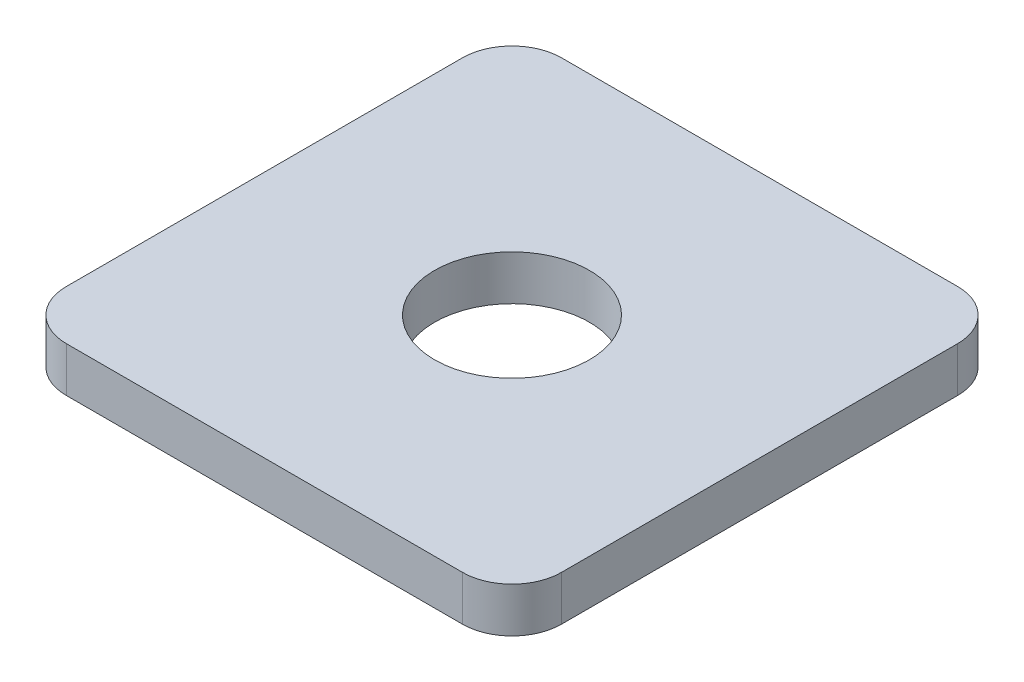
ISO-10303-21;
HEADER;
FILE_DESCRIPTION(('STEP AP214'),'2;1');
FILE_NAME('part.step','',(''),(''),'','','');
FILE_SCHEMA(('AUTOMOTIVE_DESIGN { 1 0 10303 214 1 1 1 1 }'));
ENDSEC;
DATA;
#1=APPLICATION_CONTEXT('core data for automotive mechanical design processes');
#2=APPLICATION_PROTOCOL_DEFINITION('international standard','automotive_design',2000,#1);
#3=PRODUCT_CONTEXT('',#1,'mechanical');
#4=PRODUCT('Part','Part','',(#3));
#5=PRODUCT_RELATED_PRODUCT_CATEGORY('part','',(#4));
#6=PRODUCT_DEFINITION_FORMATION('','',#4);
#7=PRODUCT_DEFINITION_CONTEXT('part definition',#1,'design');
#8=PRODUCT_DEFINITION('design','',#6,#7);
#9=PRODUCT_DEFINITION_SHAPE('','',#8);
#10=(LENGTH_UNIT() NAMED_UNIT(*) SI_UNIT(.MILLI.,.METRE.));
#11=(NAMED_UNIT(*) PLANE_ANGLE_UNIT() SI_UNIT($,.RADIAN.));
#12=(NAMED_UNIT(*) SI_UNIT($,.STERADIAN.) SOLID_ANGLE_UNIT());
#13=UNCERTAINTY_MEASURE_WITH_UNIT(LENGTH_MEASURE(1.E-05),#10,'distance_accuracy_value','');
#14=(GEOMETRIC_REPRESENTATION_CONTEXT(3) GLOBAL_UNCERTAINTY_ASSIGNED_CONTEXT((#13)) GLOBAL_UNIT_ASSIGNED_CONTEXT((#10,
#11,#12)) REPRESENTATION_CONTEXT('',''));
#15=CARTESIAN_POINT('',(0.,0.,0.));
#16=DIRECTION('',(0.,0.,1.));
#17=DIRECTION('',(1.,0.,0.));
#18=AXIS2_PLACEMENT_3D('',#15,#16,#17);
#19=CARTESIAN_POINT('',(63.,6.35,-7.));
#20=DIRECTION('',(0.,-1.,0.));
#21=DIRECTION('',(0.,0.,-1.));
#22=AXIS2_PLACEMENT_3D('',#19,#20,#21);
#23=CYLINDRICAL_SURFACE('',#22,7.);
#24=CARTESIAN_POINT('',(63.,0.,-7.));
#25=DIRECTION('',(0.,1.,0.));
#26=DIRECTION('',(0.,0.,1.));
#27=AXIS2_PLACEMENT_3D('',#24,#25,#26);
#28=CIRCLE('',#27,7.);
#29=CARTESIAN_POINT('',(63.,0.,0.));
#30=VERTEX_POINT('',#29);
#31=CARTESIAN_POINT('',(70.,0.,-7.00000000000005));
#32=VERTEX_POINT('',#31);
#33=EDGE_CURVE('E140',#30,#32,#28,.T.);
#34=ORIENTED_EDGE('',*,*,#33,.T.);
#35=DIRECTION('',(0.,-1.,0.));
#36=VECTOR('',#35,1.);
#37=CARTESIAN_POINT('',(70.,6.35,-7.00000000000005));
#38=LINE('',#37,#36);
#39=CARTESIAN_POINT('',(70.,6.35,-7.00000000000005));
#40=VERTEX_POINT('',#39);
#41=EDGE_CURVE('E11',#40,#32,#38,.T.);
#42=ORIENTED_EDGE('',*,*,#41,.F.);
#43=CARTESIAN_POINT('',(63.,6.35,-7.));
#44=DIRECTION('',(0.,1.,0.));
#45=DIRECTION('',(0.,0.,1.));
#46=AXIS2_PLACEMENT_3D('',#43,#44,#45);
#47=CIRCLE('',#46,7.);
#48=CARTESIAN_POINT('',(63.,6.35,0.));
#49=VERTEX_POINT('',#48);
#50=EDGE_CURVE('E163',#49,#40,#47,.T.);
#51=ORIENTED_EDGE('',*,*,#50,.F.);
#52=DIRECTION('',(0.,-1.,0.));
#53=VECTOR('',#52,1.);
#54=CARTESIAN_POINT('',(63.,6.35,0.));
#55=LINE('',#54,#53);
#56=EDGE_CURVE('E136',#49,#30,#55,.T.);
#57=ORIENTED_EDGE('',*,*,#56,.T.);
#58=EDGE_LOOP('',(#34,#42,#51,#57));
#59=FACE_BOUND('',#58,.T.);
#60=ADVANCED_FACE('F39',(#59),#23,.T.);
#61=CARTESIAN_POINT('',(70.,6.35,-7.00000000000005));
#62=DIRECTION('',(-1.,0.,0.));
#63=DIRECTION('',(0.,0.,1.));
#64=AXIS2_PLACEMENT_3D('',#61,#62,#63);
#65=PLANE('',#64);
#66=DIRECTION('',(0.,0.,-1.));
#67=VECTOR('',#66,1.);
#68=CARTESIAN_POINT('',(70.,0.,-7.00000000000005));
#69=LINE('',#68,#67);
#70=CARTESIAN_POINT('',(70.,0.,-63.));
#71=VERTEX_POINT('',#70);
#72=EDGE_CURVE('E144',#32,#71,#69,.T.);
#73=ORIENTED_EDGE('',*,*,#72,.T.);
#74=DIRECTION('',(0.,-1.,0.));
#75=VECTOR('',#74,1.);
#76=CARTESIAN_POINT('',(70.,6.35,-63.));
#77=LINE('',#76,#75);
#78=CARTESIAN_POINT('',(70.,6.35,-63.));
#79=VERTEX_POINT('',#78);
#80=EDGE_CURVE('E48',#79,#71,#77,.T.);
#81=ORIENTED_EDGE('',*,*,#80,.F.);
#82=DIRECTION('',(0.,0.,-1.));
#83=VECTOR('',#82,1.);
#84=CARTESIAN_POINT('',(70.,6.35,-7.00000000000005));
#85=LINE('',#84,#83);
#86=EDGE_CURVE('E99',#40,#79,#85,.T.);
#87=ORIENTED_EDGE('',*,*,#86,.F.);
#88=ORIENTED_EDGE('',*,*,#41,.T.);
#89=EDGE_LOOP('',(#73,#81,#87,#88));
#90=FACE_BOUND('',#89,.T.);
#91=ADVANCED_FACE('F232',(#90),#65,.F.);
#92=CARTESIAN_POINT('',(63.,6.35,-63.));
#93=DIRECTION('',(0.,-1.,0.));
#94=DIRECTION('',(0.,0.,-1.));
#95=AXIS2_PLACEMENT_3D('',#92,#93,#94);
#96=CYLINDRICAL_SURFACE('',#95,7.00000000000001);
#97=CARTESIAN_POINT('',(63.,0.,-63.));
#98=DIRECTION('',(0.,1.,0.));
#99=DIRECTION('',(0.,0.,-1.));
#100=AXIS2_PLACEMENT_3D('',#97,#98,#99);
#101=CIRCLE('',#100,7.00000000000001);
#102=CARTESIAN_POINT('',(63.,0.,-70.));
#103=VERTEX_POINT('',#102);
#104=EDGE_CURVE('E148',#71,#103,#101,.T.);
#105=ORIENTED_EDGE('',*,*,#104,.T.);
#106=DIRECTION('',(0.,-1.,0.));
#107=VECTOR('',#106,1.);
#108=CARTESIAN_POINT('',(63.,6.35,-70.));
#109=LINE('',#108,#107);
#110=CARTESIAN_POINT('',(63.,6.35,-70.));
#111=VERTEX_POINT('',#110);
#112=EDGE_CURVE('E174',#111,#103,#109,.T.);
#113=ORIENTED_EDGE('',*,*,#112,.F.);
#114=CARTESIAN_POINT('',(63.,6.35,-63.));
#115=DIRECTION('',(0.,1.,0.));
#116=DIRECTION('',(0.,0.,-1.));
#117=AXIS2_PLACEMENT_3D('',#114,#115,#116);
#118=CIRCLE('',#117,7.00000000000001);
#119=EDGE_CURVE('E184',#79,#111,#118,.T.);
#120=ORIENTED_EDGE('',*,*,#119,.F.);
#121=ORIENTED_EDGE('',*,*,#80,.T.);
#122=EDGE_LOOP('',(#105,#113,#120,#121));
#123=FACE_BOUND('',#122,.T.);
#124=ADVANCED_FACE('F182',(#123),#96,.T.);
#125=CARTESIAN_POINT('',(7.00000000000005,6.35,-70.));
#126=DIRECTION('',(0.,0.,1.));
#127=DIRECTION('',(1.,0.,0.));
#128=AXIS2_PLACEMENT_3D('',#125,#126,#127);
#129=PLANE('',#128);
#130=DIRECTION('',(-1.,0.,0.));
#131=VECTOR('',#130,1.);
#132=CARTESIAN_POINT('',(7.00000000000005,0.,-70.));
#133=LINE('',#132,#131);
#134=CARTESIAN_POINT('',(7.,0.,-70.));
#135=VERTEX_POINT('',#134);
#136=EDGE_CURVE('E151',#103,#135,#133,.T.);
#137=ORIENTED_EDGE('',*,*,#136,.T.);
#138=DIRECTION('',(0.,-1.,0.));
#139=VECTOR('',#138,1.);
#140=CARTESIAN_POINT('',(7.,6.35,-70.));
#141=LINE('',#140,#139);
#142=CARTESIAN_POINT('',(7.,6.35,-70.));
#143=VERTEX_POINT('',#142);
#144=EDGE_CURVE('E170',#143,#135,#141,.T.);
#145=ORIENTED_EDGE('',*,*,#144,.F.);
#146=DIRECTION('',(-1.,0.,0.));
#147=VECTOR('',#146,1.);
#148=CARTESIAN_POINT('',(7.00000000000005,6.35,-70.));
#149=LINE('',#148,#147);
#150=EDGE_CURVE('E197',#111,#143,#149,.T.);
#151=ORIENTED_EDGE('',*,*,#150,.F.);
#152=ORIENTED_EDGE('',*,*,#112,.T.);
#153=EDGE_LOOP('',(#137,#145,#151,#152));
#154=FACE_BOUND('',#153,.T.);
#155=ADVANCED_FACE('F192',(#154),#129,.F.);
#156=CARTESIAN_POINT('',(7.,6.35,-63.));
#157=DIRECTION('',(0.,-1.,0.));
#158=DIRECTION('',(0.,0.,-1.));
#159=AXIS2_PLACEMENT_3D('',#156,#157,#158);
#160=CYLINDRICAL_SURFACE('',#159,7.);
#161=CARTESIAN_POINT('',(7.,0.,-63.));
#162=DIRECTION('',(0.,1.,0.));
#163=DIRECTION('',(0.,0.,-1.));
#164=AXIS2_PLACEMENT_3D('',#161,#162,#163);
#165=CIRCLE('',#164,7.);
#166=CARTESIAN_POINT('',(0.,0.,-63.));
#167=VERTEX_POINT('',#166);
#168=EDGE_CURVE('E154',#135,#167,#165,.T.);
#169=ORIENTED_EDGE('',*,*,#168,.T.);
#170=DIRECTION('',(0.,-1.,0.));
#171=VECTOR('',#170,1.);
#172=CARTESIAN_POINT('',(0.,6.35,-63.));
#173=LINE('',#172,#171);
#174=CARTESIAN_POINT('',(0.,6.35,-63.));
#175=VERTEX_POINT('',#174);
#176=EDGE_CURVE('E129',#175,#167,#173,.T.);
#177=ORIENTED_EDGE('',*,*,#176,.F.);
#178=CARTESIAN_POINT('',(7.,6.35,-63.));
#179=DIRECTION('',(0.,1.,0.));
#180=DIRECTION('',(0.,0.,-1.));
#181=AXIS2_PLACEMENT_3D('',#178,#179,#180);
#182=CIRCLE('',#181,7.);
#183=EDGE_CURVE('E118',#143,#175,#182,.T.);
#184=ORIENTED_EDGE('',*,*,#183,.F.);
#185=ORIENTED_EDGE('',*,*,#144,.T.);
#186=EDGE_LOOP('',(#169,#177,#184,#185));
#187=FACE_BOUND('',#186,.T.);
#188=ADVANCED_FACE('F195',(#187),#160,.T.);
#189=CARTESIAN_POINT('',(0.,6.35,-7.00000000000005));
#190=DIRECTION('',(1.,0.,0.));
#191=DIRECTION('',(0.,0.,-1.));
#192=AXIS2_PLACEMENT_3D('',#189,#190,#191);
#193=PLANE('',#192);
#194=DIRECTION('',(0.,0.,1.));
#195=VECTOR('',#194,1.);
#196=CARTESIAN_POINT('',(0.,0.,-7.00000000000005));
#197=LINE('',#196,#195);
#198=CARTESIAN_POINT('',(0.,0.,-7.00000000000005));
#199=VERTEX_POINT('',#198);
#200=EDGE_CURVE('E127',#167,#199,#197,.T.);
#201=ORIENTED_EDGE('',*,*,#200,.T.);
#202=DIRECTION('',(0.,-1.,0.));
#203=VECTOR('',#202,1.);
#204=CARTESIAN_POINT('',(0.,6.35,-7.00000000000005));
#205=LINE('',#204,#203);
#206=CARTESIAN_POINT('',(0.,6.35,-7.00000000000005));
#207=VERTEX_POINT('',#206);
#208=EDGE_CURVE('E124',#207,#199,#205,.T.);
#209=ORIENTED_EDGE('',*,*,#208,.F.);
#210=DIRECTION('',(0.,0.,1.));
#211=VECTOR('',#210,1.);
#212=CARTESIAN_POINT('',(0.,6.35,-7.00000000000005));
#213=LINE('',#212,#211);
#214=EDGE_CURVE('E112',#175,#207,#213,.T.);
#215=ORIENTED_EDGE('',*,*,#214,.F.);
#216=ORIENTED_EDGE('',*,*,#176,.T.);
#217=EDGE_LOOP('',(#201,#209,#215,#216));
#218=FACE_BOUND('',#217,.T.);
#219=ADVANCED_FACE('F125',(#218),#193,.F.);
#220=CARTESIAN_POINT('',(7.,6.35,-7.));
#221=DIRECTION('',(0.,-1.,0.));
#222=DIRECTION('',(0.,0.,-1.));
#223=AXIS2_PLACEMENT_3D('',#220,#221,#222);
#224=CYLINDRICAL_SURFACE('',#223,7.);
#225=CARTESIAN_POINT('',(7.,0.,-7.));
#226=DIRECTION('',(0.,1.,0.));
#227=DIRECTION('',(0.,0.,-1.));
#228=AXIS2_PLACEMENT_3D('',#225,#226,#227);
#229=CIRCLE('',#228,7.);
#230=CARTESIAN_POINT('',(7.00000000000005,0.,0.));
#231=VERTEX_POINT('',#230);
#232=EDGE_CURVE('E85',#199,#231,#229,.T.);
#233=ORIENTED_EDGE('',*,*,#232,.T.);
#234=DIRECTION('',(0.,-1.,0.));
#235=VECTOR('',#234,1.);
#236=CARTESIAN_POINT('',(7.00000000000005,6.35,0.));
#237=LINE('',#236,#235);
#238=CARTESIAN_POINT('',(7.00000000000005,6.35,0.));
#239=VERTEX_POINT('',#238);
#240=EDGE_CURVE('E130',#239,#231,#237,.T.);
#241=ORIENTED_EDGE('',*,*,#240,.F.);
#242=CARTESIAN_POINT('',(7.,6.35,-7.));
#243=DIRECTION('',(0.,1.,0.));
#244=DIRECTION('',(0.,0.,-1.));
#245=AXIS2_PLACEMENT_3D('',#242,#243,#244);
#246=CIRCLE('',#245,7.);
#247=EDGE_CURVE('E116',#207,#239,#246,.T.);
#248=ORIENTED_EDGE('',*,*,#247,.F.);
#249=ORIENTED_EDGE('',*,*,#208,.T.);
#250=EDGE_LOOP('',(#233,#241,#248,#249));
#251=FACE_BOUND('',#250,.T.);
#252=ADVANCED_FACE('F132',(#251),#224,.T.);
#253=CARTESIAN_POINT('',(7.00000000000005,6.35,0.));
#254=DIRECTION('',(0.,0.,-1.));
#255=DIRECTION('',(-1.,0.,0.));
#256=AXIS2_PLACEMENT_3D('',#253,#254,#255);
#257=PLANE('',#256);
#258=DIRECTION('',(1.,0.,0.));
#259=VECTOR('',#258,1.);
#260=CARTESIAN_POINT('',(7.00000000000005,0.,0.));
#261=LINE('',#260,#259);
#262=EDGE_CURVE('E91',#231,#30,#261,.T.);
#263=ORIENTED_EDGE('',*,*,#262,.T.);
#264=ORIENTED_EDGE('',*,*,#56,.F.);
#265=DIRECTION('',(1.,0.,0.));
#266=VECTOR('',#265,1.);
#267=CARTESIAN_POINT('',(7.00000000000005,6.35,0.));
#268=LINE('',#267,#266);
#269=EDGE_CURVE('E56',#239,#49,#268,.T.);
#270=ORIENTED_EDGE('',*,*,#269,.F.);
#271=ORIENTED_EDGE('',*,*,#240,.T.);
#272=EDGE_LOOP('',(#263,#264,#270,#271));
#273=FACE_BOUND('',#272,.T.);
#274=ADVANCED_FACE('F223',(#273),#257,.F.);
#275=CARTESIAN_POINT('',(63.,6.35,-7.));
#276=DIRECTION('',(0.,1.,0.));
#277=DIRECTION('',(0.,0.,1.));
#278=AXIS2_PLACEMENT_3D('',#275,#276,#277);
#279=PLANE('',#278);
#280=CARTESIAN_POINT('',(35.,6.35,-35.));
#281=DIRECTION('',(0.,1.,0.));
#282=DIRECTION('',(0.,0.,1.));
#283=AXIS2_PLACEMENT_3D('',#280,#281,#282);
#284=CIRCLE('',#283,10.95);
#285=CARTESIAN_POINT('',(35.,6.35,-24.05));
#286=VERTEX_POINT('',#285);
#287=EDGE_CURVE('E207',#286,#286,#284,.T.);
#288=ORIENTED_EDGE('',*,*,#287,.F.);
#289=EDGE_LOOP('',(#288));
#290=FACE_BOUND('',#289,.T.);
#291=ORIENTED_EDGE('',*,*,#50,.T.);
#292=ORIENTED_EDGE('',*,*,#86,.T.);
#293=ORIENTED_EDGE('',*,*,#119,.T.);
#294=ORIENTED_EDGE('',*,*,#150,.T.);
#295=ORIENTED_EDGE('',*,*,#183,.T.);
#296=ORIENTED_EDGE('',*,*,#214,.T.);
#297=ORIENTED_EDGE('',*,*,#247,.T.);
#298=ORIENTED_EDGE('',*,*,#269,.T.);
#299=EDGE_LOOP('',(#291,#292,#293,#294,#295,#296,#297,#298));
#300=FACE_BOUND('',#299,.T.);
#301=ADVANCED_FACE('F114',(#290,#300),#279,.T.);
#302=CARTESIAN_POINT('',(63.,0.,-7.));
#303=DIRECTION('',(0.,1.,0.));
#304=DIRECTION('',(0.,0.,1.));
#305=AXIS2_PLACEMENT_3D('',#302,#303,#304);
#306=PLANE('',#305);
#307=CARTESIAN_POINT('',(35.,0.,-35.));
#308=DIRECTION('',(0.,1.,0.));
#309=DIRECTION('',(0.,0.,1.));
#310=AXIS2_PLACEMENT_3D('',#307,#308,#309);
#311=CIRCLE('',#310,10.95);
#312=CARTESIAN_POINT('',(35.,0.,-24.05));
#313=VERTEX_POINT('',#312);
#314=EDGE_CURVE('E145',#313,#313,#311,.T.);
#315=ORIENTED_EDGE('',*,*,#314,.T.);
#316=EDGE_LOOP('',(#315));
#317=FACE_BOUND('',#316,.T.);
#318=ORIENTED_EDGE('',*,*,#33,.F.);
#319=ORIENTED_EDGE('',*,*,#262,.F.);
#320=ORIENTED_EDGE('',*,*,#232,.F.);
#321=ORIENTED_EDGE('',*,*,#200,.F.);
#322=ORIENTED_EDGE('',*,*,#168,.F.);
#323=ORIENTED_EDGE('',*,*,#136,.F.);
#324=ORIENTED_EDGE('',*,*,#104,.F.);
#325=ORIENTED_EDGE('',*,*,#72,.F.);
#326=EDGE_LOOP('',(#318,#319,#320,#321,#322,#323,#324,#325));
#327=FACE_BOUND('',#326,.T.);
#328=ADVANCED_FACE('F188',(#317,#327),#306,.F.);
#329=CARTESIAN_POINT('',(35.,0.,-35.));
#330=DIRECTION('',(0.,1.,0.));
#331=DIRECTION('',(0.,0.,1.));
#332=AXIS2_PLACEMENT_3D('',#329,#330,#331);
#333=CYLINDRICAL_SURFACE('',#332,10.95);
#334=ORIENTED_EDGE('',*,*,#314,.F.);
#335=EDGE_LOOP('',(#334));
#336=FACE_BOUND('',#335,.T.);
#337=ORIENTED_EDGE('',*,*,#287,.T.);
#338=EDGE_LOOP('',(#337));
#339=FACE_BOUND('',#338,.T.);
#340=ADVANCED_FACE('F216',(#336,#339),#333,.F.);
#341=CLOSED_SHELL('',(#60,#91,#124,#155,#188,#219,#252,#274,#301,#328,#340));
#342=MANIFOLD_SOLID_BREP('B2',#341);
#343=ADVANCED_BREP_SHAPE_REPRESENTATION('',(#18,#342),#14);
#344=SHAPE_DEFINITION_REPRESENTATION(#9,#343);
ENDSEC;
END-ISO-10303-21;
